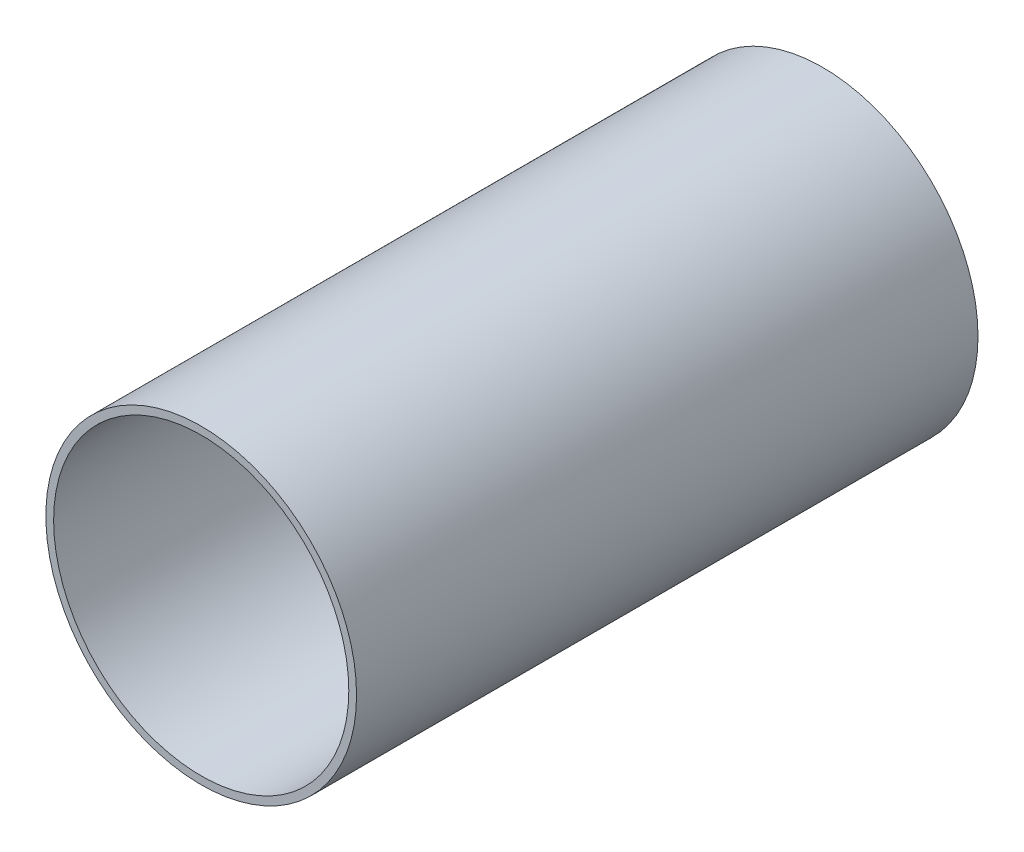
ISO-10303-21;
HEADER;
FILE_DESCRIPTION(('STEP AP214'),'2;1');
FILE_NAME('part.step','',(''),(''),'','','');
FILE_SCHEMA(('AUTOMOTIVE_DESIGN { 1 0 10303 214 1 1 1 1 }'));
ENDSEC;
DATA;
#1=APPLICATION_CONTEXT('core data for automotive mechanical design processes');
#2=APPLICATION_PROTOCOL_DEFINITION('international standard','automotive_design',2000,#1);
#3=PRODUCT_CONTEXT('',#1,'mechanical');
#4=PRODUCT('Part','Part','',(#3));
#5=PRODUCT_RELATED_PRODUCT_CATEGORY('part','',(#4));
#6=PRODUCT_DEFINITION_FORMATION('','',#4);
#7=PRODUCT_DEFINITION_CONTEXT('part definition',#1,'design');
#8=PRODUCT_DEFINITION('design','',#6,#7);
#9=PRODUCT_DEFINITION_SHAPE('','',#8);
#10=(LENGTH_UNIT() NAMED_UNIT(*) SI_UNIT(.MILLI.,.METRE.));
#11=(NAMED_UNIT(*) PLANE_ANGLE_UNIT() SI_UNIT($,.RADIAN.));
#12=(NAMED_UNIT(*) SI_UNIT($,.STERADIAN.) SOLID_ANGLE_UNIT());
#13=UNCERTAINTY_MEASURE_WITH_UNIT(LENGTH_MEASURE(1.E-05),#10,'distance_accuracy_value','');
#14=(GEOMETRIC_REPRESENTATION_CONTEXT(3) GLOBAL_UNCERTAINTY_ASSIGNED_CONTEXT((#13)) GLOBAL_UNIT_ASSIGNED_CONTEXT((#10,
#11,#12)) REPRESENTATION_CONTEXT('',''));
#15=CARTESIAN_POINT('',(0.,0.,0.));
#16=DIRECTION('',(0.,0.,1.));
#17=DIRECTION('',(1.,0.,0.));
#18=AXIS2_PLACEMENT_3D('',#15,#16,#17);
#19=CARTESIAN_POINT('',(0.,0.,400.));
#20=DIRECTION('',(0.,0.,1.));
#21=DIRECTION('',(1.,0.,0.));
#22=AXIS2_PLACEMENT_3D('',#19,#20,#21);
#23=PLANE('',#22);
#24=CARTESIAN_POINT('',(0.,0.,400.));
#25=DIRECTION('',(0.,0.,1.));
#26=DIRECTION('',(1.,0.,0.));
#27=AXIS2_PLACEMENT_3D('',#24,#25,#26);
#28=CIRCLE('',#27,100.);
#29=CARTESIAN_POINT('',(100.,0.,400.));
#30=VERTEX_POINT('',#29);
#31=EDGE_CURVE('E10',#30,#30,#28,.T.);
#32=ORIENTED_EDGE('',*,*,#31,.T.);
#33=EDGE_LOOP('',(#32));
#34=FACE_BOUND('',#33,.T.);
#35=CARTESIAN_POINT('',(0.,0.,400.));
#36=DIRECTION('',(0.,0.,1.));
#37=DIRECTION('',(1.,0.,0.));
#38=AXIS2_PLACEMENT_3D('',#35,#36,#37);
#39=CIRCLE('',#38,95.);
#40=CARTESIAN_POINT('',(95.,0.,400.));
#41=VERTEX_POINT('',#40);
#42=EDGE_CURVE('E50',#41,#41,#39,.T.);
#43=ORIENTED_EDGE('',*,*,#42,.F.);
#44=EDGE_LOOP('',(#43));
#45=FACE_BOUND('',#44,.T.);
#46=ADVANCED_FACE('F39',(#34,#45),#23,.T.);
#47=CARTESIAN_POINT('',(0.,0.,0.));
#48=DIRECTION('',(0.,0.,1.));
#49=DIRECTION('',(1.,0.,0.));
#50=AXIS2_PLACEMENT_3D('',#47,#48,#49);
#51=PLANE('',#50);
#52=CARTESIAN_POINT('',(0.,0.,0.));
#53=DIRECTION('',(0.,0.,1.));
#54=DIRECTION('',(1.,0.,0.));
#55=AXIS2_PLACEMENT_3D('',#52,#53,#54);
#56=CIRCLE('',#55,100.);
#57=CARTESIAN_POINT('',(100.,0.,0.));
#58=VERTEX_POINT('',#57);
#59=EDGE_CURVE('E43',#58,#58,#56,.T.);
#60=ORIENTED_EDGE('',*,*,#59,.F.);
#61=EDGE_LOOP('',(#60));
#62=FACE_BOUND('',#61,.T.);
#63=CARTESIAN_POINT('',(0.,0.,0.));
#64=DIRECTION('',(0.,0.,1.));
#65=DIRECTION('',(1.,0.,0.));
#66=AXIS2_PLACEMENT_3D('',#63,#64,#65);
#67=CIRCLE('',#66,95.);
#68=CARTESIAN_POINT('',(95.,0.,0.));
#69=VERTEX_POINT('',#68);
#70=EDGE_CURVE('E52',#69,#69,#67,.T.);
#71=ORIENTED_EDGE('',*,*,#70,.T.);
#72=EDGE_LOOP('',(#71));
#73=FACE_BOUND('',#72,.T.);
#74=ADVANCED_FACE('F62',(#62,#73),#51,.F.);
#75=CARTESIAN_POINT('',(0.,0.,400.));
#76=DIRECTION('',(0.,0.,-1.));
#77=DIRECTION('',(-1.,0.,0.));
#78=AXIS2_PLACEMENT_3D('',#75,#76,#77);
#79=CYLINDRICAL_SURFACE('',#78,100.);
#80=ORIENTED_EDGE('',*,*,#31,.F.);
#81=EDGE_LOOP('',(#80));
#82=FACE_BOUND('',#81,.T.);
#83=ORIENTED_EDGE('',*,*,#59,.T.);
#84=EDGE_LOOP('',(#83));
#85=FACE_BOUND('',#84,.T.);
#86=ADVANCED_FACE('F41',(#82,#85),#79,.T.);
#87=CARTESIAN_POINT('',(0.,0.,400.));
#88=DIRECTION('',(0.,0.,-1.));
#89=DIRECTION('',(-1.,0.,0.));
#90=AXIS2_PLACEMENT_3D('',#87,#88,#89);
#91=CYLINDRICAL_SURFACE('',#90,95.);
#92=ORIENTED_EDGE('',*,*,#42,.T.);
#93=EDGE_LOOP('',(#92));
#94=FACE_BOUND('',#93,.T.);
#95=ORIENTED_EDGE('',*,*,#70,.F.);
#96=EDGE_LOOP('',(#95));
#97=FACE_BOUND('',#96,.T.);
#98=ADVANCED_FACE('F58',(#94,#97),#91,.F.);
#99=CLOSED_SHELL('',(#46,#74,#86,#98));
#100=MANIFOLD_SOLID_BREP('B2',#99);
#101=ADVANCED_BREP_SHAPE_REPRESENTATION('',(#18,#100),#14);
#102=SHAPE_DEFINITION_REPRESENTATION(#9,#101);
ENDSEC;
END-ISO-10303-21;
